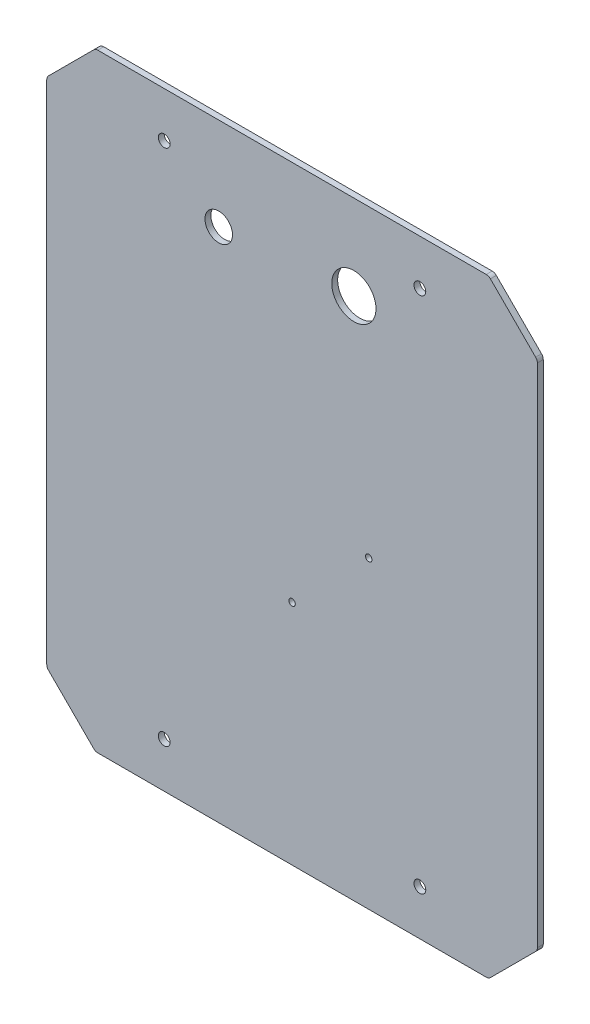
ISO-10303-21;
HEADER;
FILE_DESCRIPTION(('STEP AP214'),'2;1');
FILE_NAME('part.step','',(''),(''),'','','');
FILE_SCHEMA(('AUTOMOTIVE_DESIGN { 1 0 10303 214 1 1 1 1 }'));
ENDSEC;
DATA;
#1=APPLICATION_CONTEXT('core data for automotive mechanical design processes');
#2=APPLICATION_PROTOCOL_DEFINITION('international standard','automotive_design',2000,#1);
#3=PRODUCT_CONTEXT('',#1,'mechanical');
#4=PRODUCT('Part','Part','',(#3));
#5=PRODUCT_RELATED_PRODUCT_CATEGORY('part','',(#4));
#6=PRODUCT_DEFINITION_FORMATION('','',#4);
#7=PRODUCT_DEFINITION_CONTEXT('part definition',#1,'design');
#8=PRODUCT_DEFINITION('design','',#6,#7);
#9=PRODUCT_DEFINITION_SHAPE('','',#8);
#10=(LENGTH_UNIT() NAMED_UNIT(*) SI_UNIT(.MILLI.,.METRE.));
#11=(NAMED_UNIT(*) PLANE_ANGLE_UNIT() SI_UNIT($,.RADIAN.));
#12=(NAMED_UNIT(*) SI_UNIT($,.STERADIAN.) SOLID_ANGLE_UNIT());
#13=UNCERTAINTY_MEASURE_WITH_UNIT(LENGTH_MEASURE(1.E-05),#10,'distance_accuracy_value','');
#14=(GEOMETRIC_REPRESENTATION_CONTEXT(3) GLOBAL_UNCERTAINTY_ASSIGNED_CONTEXT((#13)) GLOBAL_UNIT_ASSIGNED_CONTEXT((#10,
#11,#12)) REPRESENTATION_CONTEXT('',''));
#15=CARTESIAN_POINT('',(0.,0.,0.));
#16=DIRECTION('',(0.,0.,1.));
#17=DIRECTION('',(1.,0.,0.));
#18=AXIS2_PLACEMENT_3D('',#15,#16,#17);
#19=CARTESIAN_POINT('',(24.7487373415291,24.7487373415292,3.));
#20=DIRECTION('',(-0.707106781186548,0.707106781186547,0.));
#21=DIRECTION('',(-0.707106781186547,-0.707106781186548,0.));
#22=AXIS2_PLACEMENT_3D('',#19,#20,#21);
#23=PLANE('',#22);
#24=DIRECTION('',(0.707106781186547,0.707106781186548,0.));
#25=VECTOR('',#24,1.);
#26=CARTESIAN_POINT('',(24.7487373415291,24.7487373415292,0.));
#27=LINE('',#26,#25);
#28=CARTESIAN_POINT('',(0.87867965644035,0.87867965644035,0.));
#29=VERTEX_POINT('',#28);
#30=CARTESIAN_POINT('',(23.8700576850888,23.8700576850888,0.));
#31=VERTEX_POINT('',#30);
#32=EDGE_CURVE('E248',#29,#31,#27,.T.);
#33=ORIENTED_EDGE('',*,*,#32,.T.);
#34=DIRECTION('',(0.,0.,-1.));
#35=VECTOR('',#34,1.);
#36=CARTESIAN_POINT('',(23.8700576850888,23.8700576850888,3.));
#37=LINE('',#36,#35);
#38=CARTESIAN_POINT('',(23.8700576850888,23.8700576850888,3.));
#39=VERTEX_POINT('',#38);
#40=EDGE_CURVE('E11',#31,#39,#37,.F.);
#41=ORIENTED_EDGE('',*,*,#40,.T.);
#42=DIRECTION('',(0.707106781186547,0.707106781186548,0.));
#43=VECTOR('',#42,1.);
#44=CARTESIAN_POINT('',(24.7487373415291,24.7487373415292,3.));
#45=LINE('',#44,#43);
#46=CARTESIAN_POINT('',(0.87867965644035,0.87867965644035,3.));
#47=VERTEX_POINT('',#46);
#48=EDGE_CURVE('E179',#47,#39,#45,.T.);
#49=ORIENTED_EDGE('',*,*,#48,.F.);
#50=DIRECTION('',(0.,0.,-1.));
#51=VECTOR('',#50,1.);
#52=CARTESIAN_POINT('',(0.87867965644035,0.878679656440354,3.));
#53=LINE('',#52,#51);
#54=EDGE_CURVE('E47',#47,#29,#53,.T.);
#55=ORIENTED_EDGE('',*,*,#54,.T.);
#56=EDGE_LOOP('',(#33,#41,#49,#55));
#57=FACE_BOUND('',#56,.T.);
#58=ADVANCED_FACE('F39',(#57),#23,.F.);
#59=CARTESIAN_POINT('',(24.7487373415291,284.748737341529,3.));
#60=DIRECTION('',(-1.,0.,0.));
#61=DIRECTION('',(0.,-1.,0.));
#62=AXIS2_PLACEMENT_3D('',#59,#60,#61);
#63=PLANE('',#62);
#64=DIRECTION('',(0.,1.,0.));
#65=VECTOR('',#64,1.);
#66=CARTESIAN_POINT('',(24.7487373415291,284.748737341529,0.));
#67=LINE('',#66,#65);
#68=CARTESIAN_POINT('',(24.7487373415291,25.9913780286485,0.));
#69=VERTEX_POINT('',#68);
#70=CARTESIAN_POINT('',(24.7487373415291,283.50609665441,0.));
#71=VERTEX_POINT('',#70);
#72=EDGE_CURVE('E253',#69,#71,#67,.T.);
#73=ORIENTED_EDGE('',*,*,#72,.T.);
#74=DIRECTION('',(0.,0.,-1.));
#75=VECTOR('',#74,1.);
#76=CARTESIAN_POINT('',(24.7487373415291,283.50609665441,3.));
#77=LINE('',#76,#75);
#78=CARTESIAN_POINT('',(24.7487373415291,283.50609665441,3.));
#79=VERTEX_POINT('',#78);
#80=EDGE_CURVE('E242',#71,#79,#77,.F.);
#81=ORIENTED_EDGE('',*,*,#80,.T.);
#82=DIRECTION('',(0.,1.,0.));
#83=VECTOR('',#82,1.);
#84=CARTESIAN_POINT('',(24.7487373415291,284.748737341529,3.));
#85=LINE('',#84,#83);
#86=CARTESIAN_POINT('',(24.7487373415291,25.9913780286485,3.));
#87=VERTEX_POINT('',#86);
#88=EDGE_CURVE('E183',#87,#79,#85,.T.);
#89=ORIENTED_EDGE('',*,*,#88,.F.);
#90=DIRECTION('',(0.,0.,-1.));
#91=VECTOR('',#90,1.);
#92=CARTESIAN_POINT('',(24.7487373415291,25.9913780286485,3.));
#93=LINE('',#92,#91);
#94=EDGE_CURVE('E239',#87,#69,#93,.T.);
#95=ORIENTED_EDGE('',*,*,#94,.T.);
#96=EDGE_LOOP('',(#73,#81,#89,#95));
#97=FACE_BOUND('',#96,.T.);
#98=ADVANCED_FACE('F386',(#97),#63,.F.);
#99=CARTESIAN_POINT('',(0.,309.497474683058,3.));
#100=DIRECTION('',(-0.707106781186547,-0.707106781186548,0.));
#101=DIRECTION('',(0.707106781186548,-0.707106781186547,0.));
#102=AXIS2_PLACEMENT_3D('',#99,#100,#101);
#103=PLANE('',#102);
#104=DIRECTION('',(-0.707106781186548,0.707106781186547,0.));
#105=VECTOR('',#104,1.);
#106=CARTESIAN_POINT('',(0.,309.497474683058,0.));
#107=LINE('',#106,#105);
#108=CARTESIAN_POINT('',(23.8700576850888,285.62741699797,0.));
#109=VERTEX_POINT('',#108);
#110=CARTESIAN_POINT('',(0.878679656440274,308.618795026618,0.));
#111=VERTEX_POINT('',#110);
#112=EDGE_CURVE('E257',#109,#111,#107,.T.);
#113=ORIENTED_EDGE('',*,*,#112,.T.);
#114=DIRECTION('',(0.,0.,-1.));
#115=VECTOR('',#114,1.);
#116=CARTESIAN_POINT('',(0.878679656440274,308.618795026618,3.));
#117=LINE('',#116,#115);
#118=CARTESIAN_POINT('',(0.878679656440274,308.618795026618,3.));
#119=VERTEX_POINT('',#118);
#120=EDGE_CURVE('E237',#111,#119,#117,.F.);
#121=ORIENTED_EDGE('',*,*,#120,.T.);
#122=DIRECTION('',(-0.707106781186548,0.707106781186547,0.));
#123=VECTOR('',#122,1.);
#124=CARTESIAN_POINT('',(0.,309.497474683058,3.));
#125=LINE('',#124,#123);
#126=CARTESIAN_POINT('',(23.8700576850888,285.62741699797,3.));
#127=VERTEX_POINT('',#126);
#128=EDGE_CURVE('E293',#127,#119,#125,.T.);
#129=ORIENTED_EDGE('',*,*,#128,.F.);
#130=DIRECTION('',(0.,0.,-1.));
#131=VECTOR('',#130,1.);
#132=CARTESIAN_POINT('',(23.8700576850888,285.62741699797,3.));
#133=LINE('',#132,#131);
#134=EDGE_CURVE('E234',#127,#109,#133,.T.);
#135=ORIENTED_EDGE('',*,*,#134,.T.);
#136=EDGE_LOOP('',(#113,#121,#129,#135));
#137=FACE_BOUND('',#136,.T.);
#138=ADVANCED_FACE('F391',(#137),#103,.F.);
#139=CARTESIAN_POINT('',(-200.,309.497474683058,3.));
#140=DIRECTION('',(0.,-1.,0.));
#141=DIRECTION('',(0.,0.,-1.));
#142=AXIS2_PLACEMENT_3D('',#139,#140,#141);
#143=PLANE('',#142);
#144=DIRECTION('',(-1.,0.,0.));
#145=VECTOR('',#144,1.);
#146=CARTESIAN_POINT('',(-200.,309.497474683058,0.));
#147=LINE('',#146,#145);
#148=CARTESIAN_POINT('',(-1.24264068711938,309.497474683058,0.));
#149=VERTEX_POINT('',#148);
#150=CARTESIAN_POINT('',(-198.757359312881,309.497474683058,0.));
#151=VERTEX_POINT('',#150);
#152=EDGE_CURVE('E267',#149,#151,#147,.T.);
#153=ORIENTED_EDGE('',*,*,#152,.T.);
#154=DIRECTION('',(0.,0.,-1.));
#155=VECTOR('',#154,1.);
#156=CARTESIAN_POINT('',(-198.757359312881,309.497474683058,3.));
#157=LINE('',#156,#155);
#158=CARTESIAN_POINT('',(-198.757359312881,309.497474683058,3.));
#159=VERTEX_POINT('',#158);
#160=EDGE_CURVE('E232',#151,#159,#157,.F.);
#161=ORIENTED_EDGE('',*,*,#160,.T.);
#162=DIRECTION('',(-1.,0.,0.));
#163=VECTOR('',#162,1.);
#164=CARTESIAN_POINT('',(-200.,309.497474683058,3.));
#165=LINE('',#164,#163);
#166=CARTESIAN_POINT('',(-1.24264068711938,309.497474683058,3.));
#167=VERTEX_POINT('',#166);
#168=EDGE_CURVE('E290',#167,#159,#165,.T.);
#169=ORIENTED_EDGE('',*,*,#168,.F.);
#170=DIRECTION('',(0.,0.,-1.));
#171=VECTOR('',#170,1.);
#172=CARTESIAN_POINT('',(-1.24264068711938,309.497474683058,3.));
#173=LINE('',#172,#171);
#174=EDGE_CURVE('E229',#167,#149,#173,.T.);
#175=ORIENTED_EDGE('',*,*,#174,.T.);
#176=EDGE_LOOP('',(#153,#161,#169,#175));
#177=FACE_BOUND('',#176,.T.);
#178=ADVANCED_FACE('F434',(#177),#143,.F.);
#179=CARTESIAN_POINT('',(-224.748737341529,284.748737341529,3.));
#180=DIRECTION('',(0.707106781186549,-0.707106781186546,0.));
#181=DIRECTION('',(0.707106781186546,0.707106781186549,0.));
#182=AXIS2_PLACEMENT_3D('',#179,#180,#181);
#183=PLANE('',#182);
#184=DIRECTION('',(-0.707106781186546,-0.707106781186549,0.));
#185=VECTOR('',#184,1.);
#186=CARTESIAN_POINT('',(-224.748737341529,284.748737341529,0.));
#187=LINE('',#186,#185);
#188=CARTESIAN_POINT('',(-200.87867965644,308.618795026618,0.));
#189=VERTEX_POINT('',#188);
#190=CARTESIAN_POINT('',(-223.870057685089,285.62741699797,0.));
#191=VERTEX_POINT('',#190);
#192=EDGE_CURVE('E270',#189,#191,#187,.T.);
#193=ORIENTED_EDGE('',*,*,#192,.T.);
#194=DIRECTION('',(0.,0.,-1.));
#195=VECTOR('',#194,1.);
#196=CARTESIAN_POINT('',(-223.870057685089,285.62741699797,3.));
#197=LINE('',#196,#195);
#198=CARTESIAN_POINT('',(-223.870057685089,285.62741699797,3.));
#199=VERTEX_POINT('',#198);
#200=EDGE_CURVE('E227',#191,#199,#197,.F.);
#201=ORIENTED_EDGE('',*,*,#200,.T.);
#202=DIRECTION('',(-0.707106781186546,-0.707106781186549,0.));
#203=VECTOR('',#202,1.);
#204=CARTESIAN_POINT('',(-224.748737341529,284.748737341529,3.));
#205=LINE('',#204,#203);
#206=CARTESIAN_POINT('',(-200.87867965644,308.618795026618,3.));
#207=VERTEX_POINT('',#206);
#208=EDGE_CURVE('E286',#207,#199,#205,.T.);
#209=ORIENTED_EDGE('',*,*,#208,.F.);
#210=DIRECTION('',(0.,0.,-1.));
#211=VECTOR('',#210,1.);
#212=CARTESIAN_POINT('',(-200.87867965644,308.618795026618,3.));
#213=LINE('',#212,#211);
#214=EDGE_CURVE('E224',#207,#189,#213,.T.);
#215=ORIENTED_EDGE('',*,*,#214,.T.);
#216=EDGE_LOOP('',(#193,#201,#209,#215));
#217=FACE_BOUND('',#216,.T.);
#218=ADVANCED_FACE('F440',(#217),#183,.F.);
#219=CARTESIAN_POINT('',(-224.748737341529,24.7487373415292,3.));
#220=DIRECTION('',(1.,0.,0.));
#221=DIRECTION('',(0.,1.,0.));
#222=AXIS2_PLACEMENT_3D('',#219,#220,#221);
#223=PLANE('',#222);
#224=DIRECTION('',(0.,-1.,0.));
#225=VECTOR('',#224,1.);
#226=CARTESIAN_POINT('',(-224.748737341529,24.7487373415292,0.));
#227=LINE('',#226,#225);
#228=CARTESIAN_POINT('',(-224.748737341529,283.50609665441,0.));
#229=VERTEX_POINT('',#228);
#230=CARTESIAN_POINT('',(-224.748737341529,25.9913780286484,0.));
#231=VERTEX_POINT('',#230);
#232=EDGE_CURVE('E185',#229,#231,#227,.T.);
#233=ORIENTED_EDGE('',*,*,#232,.T.);
#234=DIRECTION('',(0.,0.,-1.));
#235=VECTOR('',#234,1.);
#236=CARTESIAN_POINT('',(-224.748737341529,25.9913780286484,3.));
#237=LINE('',#236,#235);
#238=CARTESIAN_POINT('',(-224.748737341529,25.9913780286484,3.));
#239=VERTEX_POINT('',#238);
#240=EDGE_CURVE('E54',#231,#239,#237,.F.);
#241=ORIENTED_EDGE('',*,*,#240,.T.);
#242=DIRECTION('',(0.,-1.,0.));
#243=VECTOR('',#242,1.);
#244=CARTESIAN_POINT('',(-224.748737341529,24.7487373415292,3.));
#245=LINE('',#244,#243);
#246=CARTESIAN_POINT('',(-224.748737341529,283.50609665441,3.));
#247=VERTEX_POINT('',#246);
#248=EDGE_CURVE('E283',#247,#239,#245,.T.);
#249=ORIENTED_EDGE('',*,*,#248,.F.);
#250=DIRECTION('',(0.,0.,-1.));
#251=VECTOR('',#250,1.);
#252=CARTESIAN_POINT('',(-224.748737341529,283.50609665441,3.));
#253=LINE('',#252,#251);
#254=EDGE_CURVE('E220',#247,#229,#253,.T.);
#255=ORIENTED_EDGE('',*,*,#254,.T.);
#256=EDGE_LOOP('',(#233,#241,#249,#255));
#257=FACE_BOUND('',#256,.T.);
#258=ADVANCED_FACE('F273',(#257),#223,.F.);
#259=CARTESIAN_POINT('',(-200.,0.,3.));
#260=DIRECTION('',(0.707106781186547,0.707106781186548,0.));
#261=DIRECTION('',(-0.707106781186548,0.707106781186547,0.));
#262=AXIS2_PLACEMENT_3D('',#259,#260,#261);
#263=PLANE('',#262);
#264=DIRECTION('',(0.707106781186548,-0.707106781186547,0.));
#265=VECTOR('',#264,1.);
#266=CARTESIAN_POINT('',(-200.,0.,0.));
#267=LINE('',#266,#265);
#268=CARTESIAN_POINT('',(-223.870057685089,23.8700576850888,0.));
#269=VERTEX_POINT('',#268);
#270=CARTESIAN_POINT('',(-200.87867965644,0.878679656440342,0.));
#271=VERTEX_POINT('',#270);
#272=EDGE_CURVE('E180',#269,#271,#267,.T.);
#273=ORIENTED_EDGE('',*,*,#272,.T.);
#274=DIRECTION('',(0.,0.,-1.));
#275=VECTOR('',#274,1.);
#276=CARTESIAN_POINT('',(-200.87867965644,0.878679656440346,3.));
#277=LINE('',#276,#275);
#278=CARTESIAN_POINT('',(-200.87867965644,0.878679656440342,3.));
#279=VERTEX_POINT('',#278);
#280=EDGE_CURVE('E158',#271,#279,#277,.F.);
#281=ORIENTED_EDGE('',*,*,#280,.T.);
#282=DIRECTION('',(0.707106781186548,-0.707106781186547,0.));
#283=VECTOR('',#282,1.);
#284=CARTESIAN_POINT('',(-200.,0.,3.));
#285=LINE('',#284,#283);
#286=CARTESIAN_POINT('',(-223.870057685089,23.8700576850888,3.));
#287=VERTEX_POINT('',#286);
#288=EDGE_CURVE('E282',#287,#279,#285,.T.);
#289=ORIENTED_EDGE('',*,*,#288,.F.);
#290=DIRECTION('',(0.,0.,-1.));
#291=VECTOR('',#290,1.);
#292=CARTESIAN_POINT('',(-223.870057685089,23.8700576850888,3.));
#293=LINE('',#292,#291);
#294=EDGE_CURVE('E163',#287,#269,#293,.T.);
#295=ORIENTED_EDGE('',*,*,#294,.T.);
#296=EDGE_LOOP('',(#273,#281,#289,#295));
#297=FACE_BOUND('',#296,.T.);
#298=ADVANCED_FACE('F285',(#297),#263,.F.);
#299=CARTESIAN_POINT('',(0.,0.,3.));
#300=DIRECTION('',(0.,1.,0.));
#301=DIRECTION('',(0.,0.,1.));
#302=AXIS2_PLACEMENT_3D('',#299,#300,#301);
#303=PLANE('',#302);
#304=DIRECTION('',(1.,0.,0.));
#305=VECTOR('',#304,1.);
#306=CARTESIAN_POINT('',(0.,0.,3.));
#307=LINE('',#306,#305);
#308=CARTESIAN_POINT('',(-198.757359312881,0.,3.));
#309=VERTEX_POINT('',#308);
#310=CARTESIAN_POINT('',(-1.2426406871193,0.,3.));
#311=VERTEX_POINT('',#310);
#312=EDGE_CURVE('E173',#309,#311,#307,.T.);
#313=ORIENTED_EDGE('',*,*,#312,.F.);
#314=DIRECTION('',(0.,0.,-1.));
#315=VECTOR('',#314,1.);
#316=CARTESIAN_POINT('',(-198.757359312881,0.,3.));
#317=LINE('',#316,#315);
#318=CARTESIAN_POINT('',(-198.757359312881,0.,0.));
#319=VERTEX_POINT('',#318);
#320=EDGE_CURVE('E157',#309,#319,#317,.T.);
#321=ORIENTED_EDGE('',*,*,#320,.T.);
#322=DIRECTION('',(1.,0.,0.));
#323=VECTOR('',#322,1.);
#324=CARTESIAN_POINT('',(0.,0.,0.));
#325=LINE('',#324,#323);
#326=CARTESIAN_POINT('',(-1.2426406871193,0.,0.));
#327=VERTEX_POINT('',#326);
#328=EDGE_CURVE('E170',#319,#327,#325,.T.);
#329=ORIENTED_EDGE('',*,*,#328,.T.);
#330=DIRECTION('',(0.,0.,-1.));
#331=VECTOR('',#330,1.);
#332=CARTESIAN_POINT('',(-1.2426406871193,0.,3.));
#333=LINE('',#332,#331);
#334=EDGE_CURVE('E175',#327,#311,#333,.F.);
#335=ORIENTED_EDGE('',*,*,#334,.T.);
#336=EDGE_LOOP('',(#313,#321,#329,#335));
#337=FACE_BOUND('',#336,.T.);
#338=ADVANCED_FACE('F169',(#337),#303,.F.);
#339=CARTESIAN_POINT('',(0.,0.,3.));
#340=DIRECTION('',(0.,0.,-1.));
#341=DIRECTION('',(-1.,0.,0.));
#342=AXIS2_PLACEMENT_3D('',#339,#340,#341);
#343=PLANE('',#342);
#344=CARTESIAN_POINT('',(-137.282259715198,262.406498541596,3.));
#345=DIRECTION('',(0.,0.,-1.));
#346=DIRECTION('',(-1.,0.,0.));
#347=AXIS2_PLACEMENT_3D('',#344,#345,#346);
#348=CIRCLE('',#347,7.00000000000002);
#349=CARTESIAN_POINT('',(-144.282259715198,262.406498541596,3.));
#350=VERTEX_POINT('',#349);
#351=EDGE_CURVE('E334',#350,#350,#348,.T.);
#352=ORIENTED_EDGE('',*,*,#351,.T.);
#353=EDGE_LOOP('',(#352));
#354=FACE_BOUND('',#353,.T.);
#355=CARTESIAN_POINT('',(-68.5600251379012,266.317142531474,3.));
#356=DIRECTION('',(0.,0.,-1.));
#357=DIRECTION('',(-1.,0.,0.));
#358=AXIS2_PLACEMENT_3D('',#355,#356,#357);
#359=CIRCLE('',#358,11.25);
#360=CARTESIAN_POINT('',(-79.8100251379011,266.317142531474,3.));
#361=VERTEX_POINT('',#360);
#362=EDGE_CURVE('E323',#361,#361,#359,.T.);
#363=ORIENTED_EDGE('',*,*,#362,.T.);
#364=EDGE_LOOP('',(#363));
#365=FACE_BOUND('',#364,.T.);
#366=CARTESIAN_POINT('',(-61.,154.748737341529,3.));
#367=DIRECTION('',(0.,0.,-1.));
#368=DIRECTION('',(-1.,0.,0.));
#369=AXIS2_PLACEMENT_3D('',#366,#367,#368);
#370=CIRCLE('',#369,1.65000000000001);
#371=CARTESIAN_POINT('',(-62.65,154.748737341529,3.));
#372=VERTEX_POINT('',#371);
#373=EDGE_CURVE('E305',#372,#372,#370,.T.);
#374=ORIENTED_EDGE('',*,*,#373,.T.);
#375=EDGE_LOOP('',(#374));
#376=FACE_BOUND('',#375,.T.);
#377=CARTESIAN_POINT('',(-100.,115.748737341529,3.));
#378=DIRECTION('',(0.,0.,-1.));
#379=DIRECTION('',(-1.,0.,0.));
#380=AXIS2_PLACEMENT_3D('',#377,#378,#379);
#381=CIRCLE('',#380,1.65);
#382=CARTESIAN_POINT('',(-101.65,115.748737341529,3.));
#383=VERTEX_POINT('',#382);
#384=EDGE_CURVE('E319',#383,#383,#381,.T.);
#385=ORIENTED_EDGE('',*,*,#384,.T.);
#386=EDGE_LOOP('',(#385));
#387=FACE_BOUND('',#386,.T.);
#388=CARTESIAN_POINT('',(-35.,23.,3.));
#389=DIRECTION('',(0.,0.,-1.));
#390=DIRECTION('',(1.,0.,0.));
#391=AXIS2_PLACEMENT_3D('',#388,#389,#390);
#392=CIRCLE('',#391,3.);
#393=CARTESIAN_POINT('',(-32.,23.,3.));
#394=VERTEX_POINT('',#393);
#395=EDGE_CURVE('E301',#394,#394,#392,.T.);
#396=ORIENTED_EDGE('',*,*,#395,.T.);
#397=EDGE_LOOP('',(#396));
#398=FACE_BOUND('',#397,.T.);
#399=CARTESIAN_POINT('',(-165.,23.,3.));
#400=DIRECTION('',(0.,0.,-1.));
#401=DIRECTION('',(-1.,0.,0.));
#402=AXIS2_PLACEMENT_3D('',#399,#400,#401);
#403=CIRCLE('',#402,3.00000000000002);
#404=CARTESIAN_POINT('',(-168.,23.,3.));
#405=VERTEX_POINT('',#404);
#406=EDGE_CURVE('E308',#405,#405,#403,.T.);
#407=ORIENTED_EDGE('',*,*,#406,.T.);
#408=EDGE_LOOP('',(#407));
#409=FACE_BOUND('',#408,.T.);
#410=CARTESIAN_POINT('',(-165.,286.497474683058,3.));
#411=DIRECTION('',(0.,0.,-1.));
#412=DIRECTION('',(1.,0.,0.));
#413=AXIS2_PLACEMENT_3D('',#410,#411,#412);
#414=CIRCLE('',#413,3.00000000000002);
#415=CARTESIAN_POINT('',(-162.,286.497474683058,3.));
#416=VERTEX_POINT('',#415);
#417=EDGE_CURVE('E314',#416,#416,#414,.T.);
#418=ORIENTED_EDGE('',*,*,#417,.T.);
#419=EDGE_LOOP('',(#418));
#420=FACE_BOUND('',#419,.T.);
#421=CARTESIAN_POINT('',(-35.0000000000001,286.497474683058,3.));
#422=DIRECTION('',(0.,0.,-1.));
#423=DIRECTION('',(-1.,0.,0.));
#424=AXIS2_PLACEMENT_3D('',#421,#422,#423);
#425=CIRCLE('',#424,3.);
#426=CARTESIAN_POINT('',(-38.0000000000001,286.497474683058,3.));
#427=VERTEX_POINT('',#426);
#428=EDGE_CURVE('E254',#427,#427,#425,.T.);
#429=ORIENTED_EDGE('',*,*,#428,.T.);
#430=EDGE_LOOP('',(#429));
#431=FACE_BOUND('',#430,.T.);
#432=ORIENTED_EDGE('',*,*,#288,.T.);
#433=CARTESIAN_POINT('',(-198.757359312881,3.,3.));
#434=DIRECTION('',(0.,0.,-1.));
#435=DIRECTION('',(-1.,0.,0.));
#436=AXIS2_PLACEMENT_3D('',#433,#434,#435);
#437=CIRCLE('',#436,3.);
#438=EDGE_CURVE('E218',#279,#309,#437,.F.);
#439=ORIENTED_EDGE('',*,*,#438,.T.);
#440=ORIENTED_EDGE('',*,*,#312,.T.);
#441=CARTESIAN_POINT('',(-1.2426406871193,3.,3.));
#442=DIRECTION('',(0.,0.,-1.));
#443=DIRECTION('',(-1.,0.,0.));
#444=AXIS2_PLACEMENT_3D('',#441,#442,#443);
#445=CIRCLE('',#444,3.);
#446=EDGE_CURVE('E205',#311,#47,#445,.F.);
#447=ORIENTED_EDGE('',*,*,#446,.T.);
#448=ORIENTED_EDGE('',*,*,#48,.T.);
#449=CARTESIAN_POINT('',(21.7487373415291,25.9913780286485,3.));
#450=DIRECTION('',(0.,0.,-1.));
#451=DIRECTION('',(-1.,0.,0.));
#452=AXIS2_PLACEMENT_3D('',#449,#450,#451);
#453=CIRCLE('',#452,3.);
#454=EDGE_CURVE('E207',#39,#87,#453,.F.);
#455=ORIENTED_EDGE('',*,*,#454,.T.);
#456=ORIENTED_EDGE('',*,*,#88,.T.);
#457=CARTESIAN_POINT('',(21.7487373415291,283.50609665441,3.));
#458=DIRECTION('',(0.,0.,-1.));
#459=DIRECTION('',(-1.,0.,0.));
#460=AXIS2_PLACEMENT_3D('',#457,#458,#459);
#461=CIRCLE('',#460,3.);
#462=EDGE_CURVE('E209',#79,#127,#461,.F.);
#463=ORIENTED_EDGE('',*,*,#462,.T.);
#464=ORIENTED_EDGE('',*,*,#128,.T.);
#465=CARTESIAN_POINT('',(-1.24264068711938,306.497474683058,3.));
#466=DIRECTION('',(0.,0.,-1.));
#467=DIRECTION('',(-1.,0.,0.));
#468=AXIS2_PLACEMENT_3D('',#465,#466,#467);
#469=CIRCLE('',#468,3.);
#470=EDGE_CURVE('E211',#119,#167,#469,.F.);
#471=ORIENTED_EDGE('',*,*,#470,.T.);
#472=ORIENTED_EDGE('',*,*,#168,.T.);
#473=CARTESIAN_POINT('',(-198.757359312881,306.497474683058,3.));
#474=DIRECTION('',(0.,0.,-1.));
#475=DIRECTION('',(-1.,0.,0.));
#476=AXIS2_PLACEMENT_3D('',#473,#474,#475);
#477=CIRCLE('',#476,3.);
#478=EDGE_CURVE('E213',#159,#207,#477,.F.);
#479=ORIENTED_EDGE('',*,*,#478,.T.);
#480=ORIENTED_EDGE('',*,*,#208,.T.);
#481=CARTESIAN_POINT('',(-221.748737341529,283.50609665441,3.));
#482=DIRECTION('',(0.,0.,-1.));
#483=DIRECTION('',(-1.,0.,0.));
#484=AXIS2_PLACEMENT_3D('',#481,#482,#483);
#485=CIRCLE('',#484,3.);
#486=EDGE_CURVE('E61',#199,#247,#485,.F.);
#487=ORIENTED_EDGE('',*,*,#486,.T.);
#488=ORIENTED_EDGE('',*,*,#248,.T.);
#489=CARTESIAN_POINT('',(-221.748737341529,25.9913780286484,3.));
#490=DIRECTION('',(0.,0.,-1.));
#491=DIRECTION('',(-1.,0.,0.));
#492=AXIS2_PLACEMENT_3D('',#489,#490,#491);
#493=CIRCLE('',#492,3.);
#494=EDGE_CURVE('E216',#239,#287,#493,.F.);
#495=ORIENTED_EDGE('',*,*,#494,.T.);
#496=EDGE_LOOP('',(#432,#439,#440,#447,#448,#455,#456,#463,#464,#471,#472,#479,#480,#487,#488,#495));
#497=FACE_BOUND('',#496,.T.);
#498=ADVANCED_FACE('F281',(#354,#365,#376,#387,#398,#409,#420,#431,#497),#343,.F.);
#499=CARTESIAN_POINT('',(0.,0.,0.));
#500=DIRECTION('',(0.,0.,-1.));
#501=DIRECTION('',(-1.,0.,0.));
#502=AXIS2_PLACEMENT_3D('',#499,#500,#501);
#503=PLANE('',#502);
#504=CARTESIAN_POINT('',(-137.282259715198,262.406498541596,0.));
#505=DIRECTION('',(0.,0.,-1.));
#506=DIRECTION('',(-1.,0.,0.));
#507=AXIS2_PLACEMENT_3D('',#504,#505,#506);
#508=CIRCLE('',#507,7.00000000000002);
#509=CARTESIAN_POINT('',(-144.282259715198,262.406498541596,0.));
#510=VERTEX_POINT('',#509);
#511=EDGE_CURVE('E337',#510,#510,#508,.T.);
#512=ORIENTED_EDGE('',*,*,#511,.F.);
#513=EDGE_LOOP('',(#512));
#514=FACE_BOUND('',#513,.T.);
#515=CARTESIAN_POINT('',(-68.5600251379012,266.317142531474,0.));
#516=DIRECTION('',(0.,0.,-1.));
#517=DIRECTION('',(-1.,0.,0.));
#518=AXIS2_PLACEMENT_3D('',#515,#516,#517);
#519=CIRCLE('',#518,11.25);
#520=CARTESIAN_POINT('',(-79.8100251379011,266.317142531474,0.));
#521=VERTEX_POINT('',#520);
#522=EDGE_CURVE('E331',#521,#521,#519,.T.);
#523=ORIENTED_EDGE('',*,*,#522,.F.);
#524=EDGE_LOOP('',(#523));
#525=FACE_BOUND('',#524,.T.);
#526=CARTESIAN_POINT('',(-61.,154.748737341529,0.));
#527=DIRECTION('',(0.,0.,-1.));
#528=DIRECTION('',(-1.,0.,0.));
#529=AXIS2_PLACEMENT_3D('',#526,#527,#528);
#530=CIRCLE('',#529,1.65000000000001);
#531=CARTESIAN_POINT('',(-62.65,154.748737341529,0.));
#532=VERTEX_POINT('',#531);
#533=EDGE_CURVE('E326',#532,#532,#530,.T.);
#534=ORIENTED_EDGE('',*,*,#533,.F.);
#535=EDGE_LOOP('',(#534));
#536=FACE_BOUND('',#535,.T.);
#537=CARTESIAN_POINT('',(-100.,115.748737341529,0.));
#538=DIRECTION('',(0.,0.,-1.));
#539=DIRECTION('',(-1.,0.,0.));
#540=AXIS2_PLACEMENT_3D('',#537,#538,#539);
#541=CIRCLE('',#540,1.65);
#542=CARTESIAN_POINT('',(-101.65,115.748737341529,0.));
#543=VERTEX_POINT('',#542);
#544=EDGE_CURVE('E322',#543,#543,#541,.T.);
#545=ORIENTED_EDGE('',*,*,#544,.F.);
#546=EDGE_LOOP('',(#545));
#547=FACE_BOUND('',#546,.T.);
#548=CARTESIAN_POINT('',(-35.,23.,0.));
#549=DIRECTION('',(0.,0.,-1.));
#550=DIRECTION('',(1.,0.,0.));
#551=AXIS2_PLACEMENT_3D('',#548,#549,#550);
#552=CIRCLE('',#551,3.);
#553=CARTESIAN_POINT('',(-32.,23.,0.));
#554=VERTEX_POINT('',#553);
#555=EDGE_CURVE('E304',#554,#554,#552,.T.);
#556=ORIENTED_EDGE('',*,*,#555,.F.);
#557=EDGE_LOOP('',(#556));
#558=FACE_BOUND('',#557,.T.);
#559=CARTESIAN_POINT('',(-165.,23.,0.));
#560=DIRECTION('',(0.,0.,-1.));
#561=DIRECTION('',(-1.,0.,0.));
#562=AXIS2_PLACEMENT_3D('',#559,#560,#561);
#563=CIRCLE('',#562,3.00000000000002);
#564=CARTESIAN_POINT('',(-168.,23.,0.));
#565=VERTEX_POINT('',#564);
#566=EDGE_CURVE('E311',#565,#565,#563,.T.);
#567=ORIENTED_EDGE('',*,*,#566,.F.);
#568=EDGE_LOOP('',(#567));
#569=FACE_BOUND('',#568,.T.);
#570=CARTESIAN_POINT('',(-165.,286.497474683058,0.));
#571=DIRECTION('',(0.,0.,-1.));
#572=DIRECTION('',(1.,0.,0.));
#573=AXIS2_PLACEMENT_3D('',#570,#571,#572);
#574=CIRCLE('',#573,3.00000000000002);
#575=CARTESIAN_POINT('',(-162.,286.497474683058,0.));
#576=VERTEX_POINT('',#575);
#577=EDGE_CURVE('E299',#576,#576,#574,.T.);
#578=ORIENTED_EDGE('',*,*,#577,.F.);
#579=EDGE_LOOP('',(#578));
#580=FACE_BOUND('',#579,.T.);
#581=CARTESIAN_POINT('',(-35.0000000000001,286.497474683058,0.));
#582=DIRECTION('',(0.,0.,-1.));
#583=DIRECTION('',(-1.,0.,0.));
#584=AXIS2_PLACEMENT_3D('',#581,#582,#583);
#585=CIRCLE('',#584,3.);
#586=CARTESIAN_POINT('',(-38.0000000000001,286.497474683058,0.));
#587=VERTEX_POINT('',#586);
#588=EDGE_CURVE('E260',#587,#587,#585,.T.);
#589=ORIENTED_EDGE('',*,*,#588,.F.);
#590=EDGE_LOOP('',(#589));
#591=FACE_BOUND('',#590,.T.);
#592=ORIENTED_EDGE('',*,*,#328,.F.);
#593=CARTESIAN_POINT('',(-198.757359312881,3.,0.));
#594=DIRECTION('',(0.,0.,-1.));
#595=DIRECTION('',(-1.,0.,0.));
#596=AXIS2_PLACEMENT_3D('',#593,#594,#595);
#597=CIRCLE('',#596,3.);
#598=EDGE_CURVE('E153',#319,#271,#597,.T.);
#599=ORIENTED_EDGE('',*,*,#598,.T.);
#600=ORIENTED_EDGE('',*,*,#272,.F.);
#601=CARTESIAN_POINT('',(-221.748737341529,25.9913780286484,0.));
#602=DIRECTION('',(0.,0.,-1.));
#603=DIRECTION('',(-1.,0.,0.));
#604=AXIS2_PLACEMENT_3D('',#601,#602,#603);
#605=CIRCLE('',#604,3.);
#606=EDGE_CURVE('E164',#269,#231,#605,.T.);
#607=ORIENTED_EDGE('',*,*,#606,.T.);
#608=ORIENTED_EDGE('',*,*,#232,.F.);
#609=CARTESIAN_POINT('',(-221.748737341529,283.50609665441,0.));
#610=DIRECTION('',(0.,0.,-1.));
#611=DIRECTION('',(-1.,0.,0.));
#612=AXIS2_PLACEMENT_3D('',#609,#610,#611);
#613=CIRCLE('',#612,3.);
#614=EDGE_CURVE('E199',#229,#191,#613,.T.);
#615=ORIENTED_EDGE('',*,*,#614,.T.);
#616=ORIENTED_EDGE('',*,*,#192,.F.);
#617=CARTESIAN_POINT('',(-198.757359312881,306.497474683058,0.));
#618=DIRECTION('',(0.,0.,-1.));
#619=DIRECTION('',(-1.,0.,0.));
#620=AXIS2_PLACEMENT_3D('',#617,#618,#619);
#621=CIRCLE('',#620,3.);
#622=EDGE_CURVE('E197',#189,#151,#621,.T.);
#623=ORIENTED_EDGE('',*,*,#622,.T.);
#624=ORIENTED_EDGE('',*,*,#152,.F.);
#625=CARTESIAN_POINT('',(-1.24264068711938,306.497474683058,0.));
#626=DIRECTION('',(0.,0.,-1.));
#627=DIRECTION('',(-1.,0.,0.));
#628=AXIS2_PLACEMENT_3D('',#625,#626,#627);
#629=CIRCLE('',#628,3.);
#630=EDGE_CURVE('E195',#149,#111,#629,.T.);
#631=ORIENTED_EDGE('',*,*,#630,.T.);
#632=ORIENTED_EDGE('',*,*,#112,.F.);
#633=CARTESIAN_POINT('',(21.7487373415291,283.50609665441,0.));
#634=DIRECTION('',(0.,0.,-1.));
#635=DIRECTION('',(-1.,0.,0.));
#636=AXIS2_PLACEMENT_3D('',#633,#634,#635);
#637=CIRCLE('',#636,3.);
#638=EDGE_CURVE('E193',#109,#71,#637,.T.);
#639=ORIENTED_EDGE('',*,*,#638,.T.);
#640=ORIENTED_EDGE('',*,*,#72,.F.);
#641=CARTESIAN_POINT('',(21.7487373415291,25.9913780286485,0.));
#642=DIRECTION('',(0.,0.,-1.));
#643=DIRECTION('',(-1.,0.,0.));
#644=AXIS2_PLACEMENT_3D('',#641,#642,#643);
#645=CIRCLE('',#644,3.);
#646=EDGE_CURVE('E191',#69,#31,#645,.T.);
#647=ORIENTED_EDGE('',*,*,#646,.T.);
#648=ORIENTED_EDGE('',*,*,#32,.F.);
#649=CARTESIAN_POINT('',(-1.2426406871193,3.,0.));
#650=DIRECTION('',(0.,0.,-1.));
#651=DIRECTION('',(-1.,0.,0.));
#652=AXIS2_PLACEMENT_3D('',#649,#650,#651);
#653=CIRCLE('',#652,3.);
#654=EDGE_CURVE('E174',#29,#327,#653,.T.);
#655=ORIENTED_EDGE('',*,*,#654,.T.);
#656=EDGE_LOOP('',(#592,#599,#600,#607,#608,#615,#616,#623,#624,#631,#632,#639,#640,#647,#648,#655));
#657=FACE_BOUND('',#656,.T.);
#658=ADVANCED_FACE('F177',(#514,#525,#536,#547,#558,#569,#580,#591,#657),#503,.T.);
#659=CARTESIAN_POINT('',(-198.757359312881,3.,3.));
#660=DIRECTION('',(0.,0.,-1.));
#661=DIRECTION('',(-1.,0.,0.));
#662=AXIS2_PLACEMENT_3D('',#659,#660,#661);
#663=CYLINDRICAL_SURFACE('',#662,3.);
#664=ORIENTED_EDGE('',*,*,#438,.F.);
#665=ORIENTED_EDGE('',*,*,#280,.F.);
#666=ORIENTED_EDGE('',*,*,#598,.F.);
#667=ORIENTED_EDGE('',*,*,#320,.F.);
#668=EDGE_LOOP('',(#664,#665,#666,#667));
#669=FACE_BOUND('',#668,.T.);
#670=ADVANCED_FACE('F156',(#669),#663,.T.);
#671=CARTESIAN_POINT('',(-221.748737341529,25.9913780286484,3.));
#672=DIRECTION('',(0.,0.,-1.));
#673=DIRECTION('',(-1.,0.,0.));
#674=AXIS2_PLACEMENT_3D('',#671,#672,#673);
#675=CYLINDRICAL_SURFACE('',#674,3.);
#676=ORIENTED_EDGE('',*,*,#494,.F.);
#677=ORIENTED_EDGE('',*,*,#240,.F.);
#678=ORIENTED_EDGE('',*,*,#606,.F.);
#679=ORIENTED_EDGE('',*,*,#294,.F.);
#680=EDGE_LOOP('',(#676,#677,#678,#679));
#681=FACE_BOUND('',#680,.T.);
#682=ADVANCED_FACE('F277',(#681),#675,.T.);
#683=CARTESIAN_POINT('',(-221.748737341529,283.50609665441,3.));
#684=DIRECTION('',(0.,0.,-1.));
#685=DIRECTION('',(-1.,0.,0.));
#686=AXIS2_PLACEMENT_3D('',#683,#684,#685);
#687=CYLINDRICAL_SURFACE('',#686,3.);
#688=ORIENTED_EDGE('',*,*,#486,.F.);
#689=ORIENTED_EDGE('',*,*,#200,.F.);
#690=ORIENTED_EDGE('',*,*,#614,.F.);
#691=ORIENTED_EDGE('',*,*,#254,.F.);
#692=EDGE_LOOP('',(#688,#689,#690,#691));
#693=FACE_BOUND('',#692,.T.);
#694=ADVANCED_FACE('F400',(#693),#687,.T.);
#695=CARTESIAN_POINT('',(-198.757359312881,306.497474683058,3.));
#696=DIRECTION('',(0.,0.,-1.));
#697=DIRECTION('',(-1.,0.,0.));
#698=AXIS2_PLACEMENT_3D('',#695,#696,#697);
#699=CYLINDRICAL_SURFACE('',#698,3.);
#700=ORIENTED_EDGE('',*,*,#478,.F.);
#701=ORIENTED_EDGE('',*,*,#160,.F.);
#702=ORIENTED_EDGE('',*,*,#622,.F.);
#703=ORIENTED_EDGE('',*,*,#214,.F.);
#704=EDGE_LOOP('',(#700,#701,#702,#703));
#705=FACE_BOUND('',#704,.T.);
#706=ADVANCED_FACE('F403',(#705),#699,.T.);
#707=CARTESIAN_POINT('',(-1.24264068711938,306.497474683058,3.));
#708=DIRECTION('',(0.,0.,-1.));
#709=DIRECTION('',(-1.,0.,0.));
#710=AXIS2_PLACEMENT_3D('',#707,#708,#709);
#711=CYLINDRICAL_SURFACE('',#710,3.);
#712=ORIENTED_EDGE('',*,*,#470,.F.);
#713=ORIENTED_EDGE('',*,*,#120,.F.);
#714=ORIENTED_EDGE('',*,*,#630,.F.);
#715=ORIENTED_EDGE('',*,*,#174,.F.);
#716=EDGE_LOOP('',(#712,#713,#714,#715));
#717=FACE_BOUND('',#716,.T.);
#718=ADVANCED_FACE('F407',(#717),#711,.T.);
#719=CARTESIAN_POINT('',(21.7487373415291,283.50609665441,3.));
#720=DIRECTION('',(0.,0.,-1.));
#721=DIRECTION('',(-1.,0.,0.));
#722=AXIS2_PLACEMENT_3D('',#719,#720,#721);
#723=CYLINDRICAL_SURFACE('',#722,3.);
#724=ORIENTED_EDGE('',*,*,#462,.F.);
#725=ORIENTED_EDGE('',*,*,#80,.F.);
#726=ORIENTED_EDGE('',*,*,#638,.F.);
#727=ORIENTED_EDGE('',*,*,#134,.F.);
#728=EDGE_LOOP('',(#724,#725,#726,#727));
#729=FACE_BOUND('',#728,.T.);
#730=ADVANCED_FACE('F411',(#729),#723,.T.);
#731=CARTESIAN_POINT('',(21.7487373415291,25.9913780286485,3.));
#732=DIRECTION('',(0.,0.,-1.));
#733=DIRECTION('',(-1.,0.,0.));
#734=AXIS2_PLACEMENT_3D('',#731,#732,#733);
#735=CYLINDRICAL_SURFACE('',#734,3.);
#736=ORIENTED_EDGE('',*,*,#454,.F.);
#737=ORIENTED_EDGE('',*,*,#40,.F.);
#738=ORIENTED_EDGE('',*,*,#646,.F.);
#739=ORIENTED_EDGE('',*,*,#94,.F.);
#740=EDGE_LOOP('',(#736,#737,#738,#739));
#741=FACE_BOUND('',#740,.T.);
#742=ADVANCED_FACE('F381',(#741),#735,.T.);
#743=CARTESIAN_POINT('',(-1.2426406871193,3.,3.));
#744=DIRECTION('',(0.,0.,-1.));
#745=DIRECTION('',(-1.,0.,0.));
#746=AXIS2_PLACEMENT_3D('',#743,#744,#745);
#747=CYLINDRICAL_SURFACE('',#746,3.);
#748=ORIENTED_EDGE('',*,*,#446,.F.);
#749=ORIENTED_EDGE('',*,*,#334,.F.);
#750=ORIENTED_EDGE('',*,*,#654,.F.);
#751=ORIENTED_EDGE('',*,*,#54,.F.);
#752=EDGE_LOOP('',(#748,#749,#750,#751));
#753=FACE_BOUND('',#752,.T.);
#754=ADVANCED_FACE('F41',(#753),#747,.T.);
#755=CARTESIAN_POINT('',(-35.0000000000001,286.497474683058,3.));
#756=DIRECTION('',(0.,0.,-1.));
#757=DIRECTION('',(-1.,0.,0.));
#758=AXIS2_PLACEMENT_3D('',#755,#756,#757);
#759=CYLINDRICAL_SURFACE('',#758,3.);
#760=ORIENTED_EDGE('',*,*,#428,.F.);
#761=EDGE_LOOP('',(#760));
#762=FACE_BOUND('',#761,.T.);
#763=ORIENTED_EDGE('',*,*,#588,.T.);
#764=EDGE_LOOP('',(#763));
#765=FACE_BOUND('',#764,.T.);
#766=ADVANCED_FACE('F369',(#762,#765),#759,.F.);
#767=CARTESIAN_POINT('',(-165.,286.497474683058,3.));
#768=DIRECTION('',(0.,0.,-1.));
#769=DIRECTION('',(-1.,0.,0.));
#770=AXIS2_PLACEMENT_3D('',#767,#768,#769);
#771=CYLINDRICAL_SURFACE('',#770,3.00000000000002);
#772=ORIENTED_EDGE('',*,*,#417,.F.);
#773=EDGE_LOOP('',(#772));
#774=FACE_BOUND('',#773,.T.);
#775=ORIENTED_EDGE('',*,*,#577,.T.);
#776=EDGE_LOOP('',(#775));
#777=FACE_BOUND('',#776,.T.);
#778=ADVANCED_FACE('F371',(#774,#777),#771,.F.);
#779=CARTESIAN_POINT('',(-165.,23.,3.));
#780=DIRECTION('',(0.,0.,-1.));
#781=DIRECTION('',(-1.,0.,0.));
#782=AXIS2_PLACEMENT_3D('',#779,#780,#781);
#783=CYLINDRICAL_SURFACE('',#782,3.00000000000002);
#784=ORIENTED_EDGE('',*,*,#406,.F.);
#785=EDGE_LOOP('',(#784));
#786=FACE_BOUND('',#785,.T.);
#787=ORIENTED_EDGE('',*,*,#566,.T.);
#788=EDGE_LOOP('',(#787));
#789=FACE_BOUND('',#788,.T.);
#790=ADVANCED_FACE('F378',(#786,#789),#783,.F.);
#791=CARTESIAN_POINT('',(-35.,23.,3.));
#792=DIRECTION('',(0.,0.,-1.));
#793=DIRECTION('',(-1.,0.,0.));
#794=AXIS2_PLACEMENT_3D('',#791,#792,#793);
#795=CYLINDRICAL_SURFACE('',#794,3.);
#796=ORIENTED_EDGE('',*,*,#395,.F.);
#797=EDGE_LOOP('',(#796));
#798=FACE_BOUND('',#797,.T.);
#799=ORIENTED_EDGE('',*,*,#555,.T.);
#800=EDGE_LOOP('',(#799));
#801=FACE_BOUND('',#800,.T.);
#802=ADVANCED_FACE('F569',(#798,#801),#795,.F.);
#803=CARTESIAN_POINT('',(-100.,115.748737341529,3.));
#804=DIRECTION('',(0.,0.,-1.));
#805=DIRECTION('',(-1.,0.,0.));
#806=AXIS2_PLACEMENT_3D('',#803,#804,#805);
#807=CYLINDRICAL_SURFACE('',#806,1.65);
#808=ORIENTED_EDGE('',*,*,#384,.F.);
#809=EDGE_LOOP('',(#808));
#810=FACE_BOUND('',#809,.T.);
#811=ORIENTED_EDGE('',*,*,#544,.T.);
#812=EDGE_LOOP('',(#811));
#813=FACE_BOUND('',#812,.T.);
#814=ADVANCED_FACE('F580',(#810,#813),#807,.F.);
#815=CARTESIAN_POINT('',(-61.,154.748737341529,3.));
#816=DIRECTION('',(0.,0.,-1.));
#817=DIRECTION('',(-1.,0.,0.));
#818=AXIS2_PLACEMENT_3D('',#815,#816,#817);
#819=CYLINDRICAL_SURFACE('',#818,1.65000000000001);
#820=ORIENTED_EDGE('',*,*,#373,.F.);
#821=EDGE_LOOP('',(#820));
#822=FACE_BOUND('',#821,.T.);
#823=ORIENTED_EDGE('',*,*,#533,.T.);
#824=EDGE_LOOP('',(#823));
#825=FACE_BOUND('',#824,.T.);
#826=ADVANCED_FACE('F590',(#822,#825),#819,.F.);
#827=CARTESIAN_POINT('',(-68.5600251379012,266.317142531474,3.));
#828=DIRECTION('',(0.,0.,-1.));
#829=DIRECTION('',(-1.,0.,0.));
#830=AXIS2_PLACEMENT_3D('',#827,#828,#829);
#831=CYLINDRICAL_SURFACE('',#830,11.25);
#832=ORIENTED_EDGE('',*,*,#362,.F.);
#833=EDGE_LOOP('',(#832));
#834=FACE_BOUND('',#833,.T.);
#835=ORIENTED_EDGE('',*,*,#522,.T.);
#836=EDGE_LOOP('',(#835));
#837=FACE_BOUND('',#836,.T.);
#838=ADVANCED_FACE('F348',(#834,#837),#831,.F.);
#839=CARTESIAN_POINT('',(-137.282259715198,262.406498541596,3.));
#840=DIRECTION('',(0.,0.,-1.));
#841=DIRECTION('',(-1.,0.,0.));
#842=AXIS2_PLACEMENT_3D('',#839,#840,#841);
#843=CYLINDRICAL_SURFACE('',#842,7.00000000000002);
#844=ORIENTED_EDGE('',*,*,#351,.F.);
#845=EDGE_LOOP('',(#844));
#846=FACE_BOUND('',#845,.T.);
#847=ORIENTED_EDGE('',*,*,#511,.T.);
#848=EDGE_LOOP('',(#847));
#849=FACE_BOUND('',#848,.T.);
#850=ADVANCED_FACE('F345',(#846,#849),#843,.F.);
#851=CLOSED_SHELL('',(#58,#98,#138,#178,#218,#258,#298,#338,#498,#658,#670,#682,#694,#706,#718,
#730,#742,#754,#766,#778,#790,#802,#814,#826,#838,#850));
#852=MANIFOLD_SOLID_BREP('B2',#851);
#853=ADVANCED_BREP_SHAPE_REPRESENTATION('',(#18,#852),#14);
#854=SHAPE_DEFINITION_REPRESENTATION(#9,#853);
ENDSEC;
END-ISO-10303-21;
